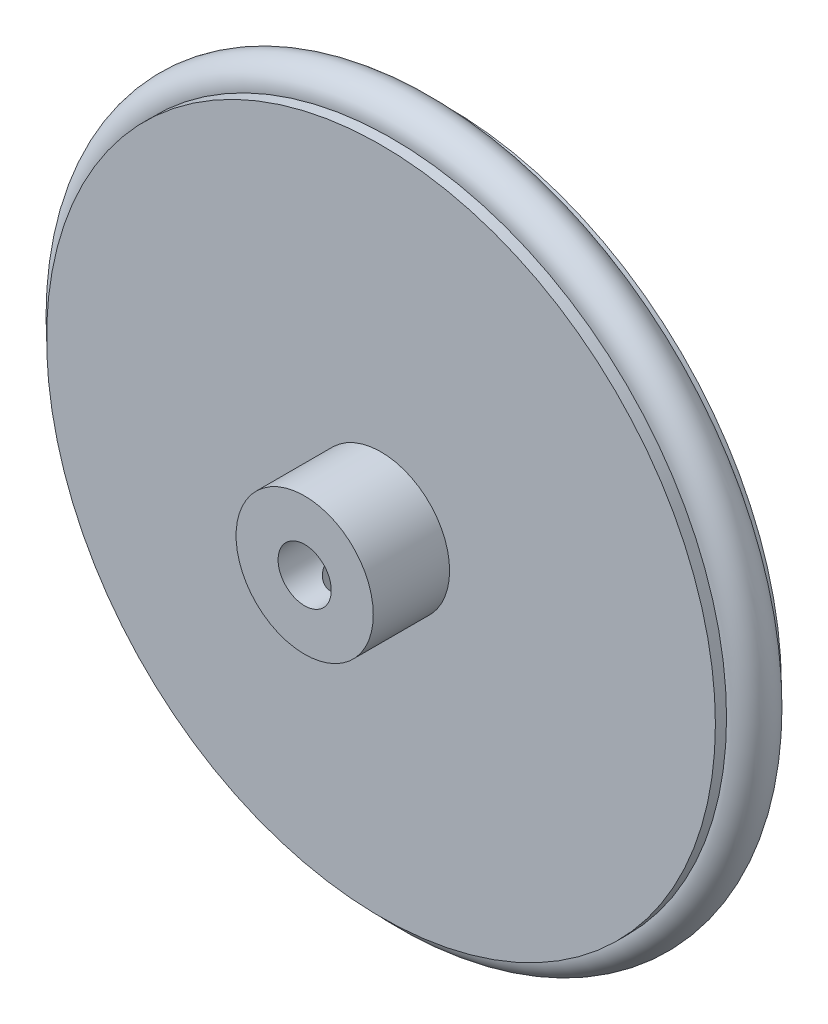
ISO-10303-21;
HEADER;
FILE_DESCRIPTION(('STEP AP214'),'2;1');
FILE_NAME('part.step','',(''),(''),'','','');
FILE_SCHEMA(('AUTOMOTIVE_DESIGN { 1 0 10303 214 1 1 1 1 }'));
ENDSEC;
DATA;
#1=APPLICATION_CONTEXT('core data for automotive mechanical design processes');
#2=APPLICATION_PROTOCOL_DEFINITION('international standard','automotive_design',2000,#1);
#3=PRODUCT_CONTEXT('',#1,'mechanical');
#4=PRODUCT('Part','Part','',(#3));
#5=PRODUCT_RELATED_PRODUCT_CATEGORY('part','',(#4));
#6=PRODUCT_DEFINITION_FORMATION('','',#4);
#7=PRODUCT_DEFINITION_CONTEXT('part definition',#1,'design');
#8=PRODUCT_DEFINITION('design','',#6,#7);
#9=PRODUCT_DEFINITION_SHAPE('','',#8);
#10=(LENGTH_UNIT() NAMED_UNIT(*) SI_UNIT(.MILLI.,.METRE.));
#11=(NAMED_UNIT(*) PLANE_ANGLE_UNIT() SI_UNIT($,.RADIAN.));
#12=(NAMED_UNIT(*) SI_UNIT($,.STERADIAN.) SOLID_ANGLE_UNIT());
#13=UNCERTAINTY_MEASURE_WITH_UNIT(LENGTH_MEASURE(1.E-05),#10,'distance_accuracy_value','');
#14=(GEOMETRIC_REPRESENTATION_CONTEXT(3) GLOBAL_UNCERTAINTY_ASSIGNED_CONTEXT((#13)) GLOBAL_UNIT_ASSIGNED_CONTEXT((#10,
#11,#12)) REPRESENTATION_CONTEXT('',''));
#15=CARTESIAN_POINT('',(0.,0.,0.));
#16=DIRECTION('',(0.,0.,1.));
#17=DIRECTION('',(1.,0.,0.));
#18=AXIS2_PLACEMENT_3D('',#15,#16,#17);
#19=CARTESIAN_POINT('',(0.,0.,0.));
#20=DIRECTION('',(0.,0.,-1.));
#21=DIRECTION('',(-1.,0.,0.));
#22=AXIS2_PLACEMENT_3D('',#19,#20,#21);
#23=TOROIDAL_SURFACE('',#22,39.2945047926736,2.56123692555145);
#24=CARTESIAN_POINT('',(39.2945047926736,0.,0.));
#25=DIRECTION('',(0.,1.,0.));
#26=DIRECTION('',(0.,0.,1.));
#27=AXIS2_PLACEMENT_3D('',#24,#25,#26);
#28=CIRCLE('',#27,2.56123692555145);
#29=CARTESIAN_POINT('',(41.855741718225,0.,0.));
#30=VERTEX_POINT('',#29);
#31=EDGE_CURVE('E11',#30,#30,#28,.T.);
#32=CARTESIAN_POINT('',(0.,0.,0.));
#33=DIRECTION('',(0.,0.,-1.));
#34=DIRECTION('',(-1.,0.,0.));
#35=AXIS2_PLACEMENT_3D('',#32,#33,#34);
#36=CIRCLE('',#35,41.855741718225);
#37=EDGE_CURVE('',#30,#30,#36,.T.);
#38=ORIENTED_EDGE('',*,*,#31,.F.);
#39=ORIENTED_EDGE('',*,*,#31,.T.);
#40=ORIENTED_EDGE('',*,*,#37,.T.);
#41=ORIENTED_EDGE('',*,*,#37,.F.);
#42=EDGE_LOOP('',(#38,#40,#39,#41));
#43=FACE_BOUND('',#42,.T.);
#44=ADVANCED_FACE('F52',(#43),#23,.T.);
#45=CLOSED_SHELL('',(#44));
#46=MANIFOLD_SOLID_BREP('B2',#45);
#47=CARTESIAN_POINT('',(0.,0.,3.85));
#48=DIRECTION('',(0.,0.,-1.));
#49=DIRECTION('',(-1.,0.,0.));
#50=AXIS2_PLACEMENT_3D('',#47,#48,#49);
#51=CYLINDRICAL_SURFACE('',#50,39.);
#52=CARTESIAN_POINT('',(0.,0.,2.55));
#53=DIRECTION('',(0.,0.,-1.));
#54=DIRECTION('',(-1.,0.,0.));
#55=AXIS2_PLACEMENT_3D('',#52,#53,#54);
#56=CIRCLE('',#55,39.);
#57=CARTESIAN_POINT('',(39.,0.,2.55));
#58=VERTEX_POINT('',#57);
#59=EDGE_CURVE('E87',#58,#58,#56,.F.);
#60=ORIENTED_EDGE('',*,*,#59,.T.);
#61=EDGE_LOOP('',(#60));
#62=FACE_BOUND('',#61,.T.);
#63=CARTESIAN_POINT('',(0.,0.,3.85));
#64=DIRECTION('',(0.,0.,1.));
#65=DIRECTION('',(1.,0.,0.));
#66=AXIS2_PLACEMENT_3D('',#63,#64,#65);
#67=CIRCLE('',#66,39.);
#68=CARTESIAN_POINT('',(39.,0.,3.85));
#69=VERTEX_POINT('',#68);
#70=EDGE_CURVE('E107',#69,#69,#67,.T.);
#71=ORIENTED_EDGE('',*,*,#70,.F.);
#72=EDGE_LOOP('',(#71));
#73=FACE_BOUND('',#72,.T.);
#74=ADVANCED_FACE('F72',(#62,#73),#51,.T.);
#75=CARTESIAN_POINT('',(0.,0.,3.85));
#76=DIRECTION('',(0.,0.,1.));
#77=DIRECTION('',(1.,0.,0.));
#78=AXIS2_PLACEMENT_3D('',#75,#76,#77);
#79=PLANE('',#78);
#80=CARTESIAN_POINT('',(0.,0.,3.85));
#81=DIRECTION('',(0.,0.,1.));
#82=DIRECTION('',(1.,0.,0.));
#83=AXIS2_PLACEMENT_3D('',#80,#81,#82);
#84=CIRCLE('',#83,8.);
#85=CARTESIAN_POINT('',(8.,0.,3.85));
#86=VERTEX_POINT('',#85);
#87=EDGE_CURVE('E50',#86,#86,#84,.T.);
#88=ORIENTED_EDGE('',*,*,#87,.F.);
#89=EDGE_LOOP('',(#88));
#90=FACE_BOUND('',#89,.T.);
#91=ORIENTED_EDGE('',*,*,#70,.T.);
#92=EDGE_LOOP('',(#91));
#93=FACE_BOUND('',#92,.T.);
#94=ADVANCED_FACE('F121',(#90,#93),#79,.T.);
#95=CARTESIAN_POINT('',(0.,0.,0.));
#96=DIRECTION('',(0.,0.,1.));
#97=DIRECTION('',(1.,0.,0.));
#98=AXIS2_PLACEMENT_3D('',#95,#96,#97);
#99=TOROIDAL_SURFACE('',#98,39.,2.55);
#100=CARTESIAN_POINT('',(39.,0.,0.));
#101=DIRECTION('',(0.,1.,0.));
#102=DIRECTION('',(0.,0.,1.));
#103=AXIS2_PLACEMENT_3D('',#100,#101,#102);
#104=CIRCLE('',#103,2.55);
#105=CARTESIAN_POINT('',(39.,0.,-2.55));
#106=VERTEX_POINT('',#105);
#107=EDGE_CURVE('E95',#106,#58,#104,.T.);
#108=ORIENTED_EDGE('',*,*,#107,.F.);
#109=CARTESIAN_POINT('',(0.,0.,-2.55));
#110=DIRECTION('',(0.,0.,1.));
#111=DIRECTION('',(1.,0.,0.));
#112=AXIS2_PLACEMENT_3D('',#109,#110,#111);
#113=CIRCLE('',#112,39.);
#114=EDGE_CURVE('E98',#106,#106,#113,.F.);
#115=ORIENTED_EDGE('',*,*,#114,.F.);
#116=ORIENTED_EDGE('',*,*,#107,.T.);
#117=ORIENTED_EDGE('',*,*,#59,.F.);
#118=EDGE_LOOP('',(#108,#115,#116,#117));
#119=FACE_BOUND('',#118,.T.);
#120=ADVANCED_FACE('F96',(#119),#99,.F.);
#121=CARTESIAN_POINT('',(0.,0.,-3.85));
#122=DIRECTION('',(0.,0.,1.));
#123=DIRECTION('',(1.,0.,0.));
#124=AXIS2_PLACEMENT_3D('',#121,#122,#123);
#125=PLANE('',#124);
#126=CARTESIAN_POINT('',(0.,0.,-3.85));
#127=DIRECTION('',(0.,0.,1.));
#128=DIRECTION('',(1.,0.,0.));
#129=AXIS2_PLACEMENT_3D('',#126,#127,#128);
#130=CIRCLE('',#129,39.);
#131=CARTESIAN_POINT('',(39.,0.,-3.85));
#132=VERTEX_POINT('',#131);
#133=EDGE_CURVE('E101',#132,#132,#130,.T.);
#134=ORIENTED_EDGE('',*,*,#133,.F.);
#135=EDGE_LOOP('',(#134));
#136=FACE_BOUND('',#135,.T.);
#137=ADVANCED_FACE('F130',(#136),#125,.F.);
#138=ORIENTED_EDGE('',*,*,#114,.T.);
#139=EDGE_LOOP('',(#138));
#140=FACE_BOUND('',#139,.T.);
#141=ORIENTED_EDGE('',*,*,#133,.T.);
#142=EDGE_LOOP('',(#141));
#143=FACE_BOUND('',#142,.T.);
#144=ADVANCED_FACE('F74',(#140,#143),#51,.T.);
#145=CARTESIAN_POINT('',(0.,0.,12.75));
#146=DIRECTION('',(0.,0.,-1.));
#147=DIRECTION('',(-1.,0.,0.));
#148=AXIS2_PLACEMENT_3D('',#145,#146,#147);
#149=CYLINDRICAL_SURFACE('',#148,8.);
#150=CARTESIAN_POINT('',(0.,-8.00000000000001,9.75));
#151=CARTESIAN_POINT('',(0.123780136226794,-7.99999842187128,9.74999762466524));
#152=CARTESIAN_POINT('',(0.247584907831838,-7.99709927975129,9.73975154955323));
#153=CARTESIAN_POINT('',(0.4916113733975,-7.98581625144001,9.69912092746626));
#154=CARTESIAN_POINT('',(0.611831603090772,-7.97743015509969,9.66872826536708));
#155=CARTESIAN_POINT('',(0.845132540047836,-7.95609599210553,9.58888321400657));
#156=CARTESIAN_POINT('',(0.958222777735977,-7.94315417420684,9.53945692312136));
#157=CARTESIAN_POINT('',(1.17450981060238,-7.91406663243914,9.4230488128937));
#158=CARTESIAN_POINT('',(1.27770565752827,-7.89792060194112,9.35606531320689));
#159=CARTESIAN_POINT('',(1.47391114059968,-7.86369767273313,9.20463867647517));
#160=CARTESIAN_POINT('',(1.5666320582482,-7.84558491763583,9.11982955125715));
#161=CARTESIAN_POINT('',(1.73674045164914,-7.80969310823846,8.93594041092291));
#162=CARTESIAN_POINT('',(1.81412570935584,-7.79191410254578,8.83685833503763));
#163=CARTESIAN_POINT('',(1.95282069316971,-7.75833082506188,8.6248728664803));
#164=CARTESIAN_POINT('',(2.01378972318442,-7.74257151336369,8.5117387845405));
#165=CARTESIAN_POINT('',(2.11572381813796,-7.71534289740211,8.27630984893527));
#166=CARTESIAN_POINT('',(2.15669303705113,-7.70387270240217,8.15401690366346));
#167=CARTESIAN_POINT('',(2.21644550121994,-7.68689269299952,7.90695889737664));
#168=CARTESIAN_POINT('',(2.23575604849789,-7.6812415038316,7.78233133077991));
#169=CARTESIAN_POINT('',(2.25328816095871,-7.67611771194809,7.53148722896237));
#170=CARTESIAN_POINT('',(2.25151415202463,-7.67664381255033,7.40527103276911));
#171=CARTESIAN_POINT('',(2.22734423131721,-7.6836891439777,7.15901963772495));
#172=CARTESIAN_POINT('',(2.20559571333701,-7.69002021911333,7.0389146421979));
#173=CARTESIAN_POINT('',(2.14313486827327,-7.70765955284748,6.80413145670784));
#174=CARTESIAN_POINT('',(2.10242087445025,-7.71896824888853,6.68945374468577));
#175=CARTESIAN_POINT('',(2.00267907192456,-7.7454475005861,6.46713725641916));
#176=CARTESIAN_POINT('',(1.94343157951608,-7.7606639669854,6.35960274110322));
#177=CARTESIAN_POINT('',(1.8084575746412,-7.7932206851871,6.15577902306305));
#178=CARTESIAN_POINT('',(1.73272749416113,-7.81056139647251,6.05949226210517));
#179=CARTESIAN_POINT('',(1.56366800478981,-7.84618747121736,5.87720947019052));
#180=CARTESIAN_POINT('',(1.46979757357976,-7.86448422457825,5.79171666666484));
#181=CARTESIAN_POINT('',(1.26882591772857,-7.89939668632421,5.63757732851264));
#182=CARTESIAN_POINT('',(1.16172404941149,-7.91601231285513,5.56893161393992));
#183=CARTESIAN_POINT('',(0.936493342648719,-7.94581242298405,5.45017851457242));
#184=CARTESIAN_POINT('',(0.818309290352517,-7.95897833521144,5.40017088166099));
#185=CARTESIAN_POINT('',(0.574754739241742,-7.98026169134054,5.32088384945746));
#186=CARTESIAN_POINT('',(0.449386001714237,-7.9883803668122,5.29159939328749));
#187=CARTESIAN_POINT('',(0.199308367677802,-7.998464596019,5.25540024709012));
#188=CARTESIAN_POINT('',(0.0747057939807261,-8.0006180153968,5.2478023339393));
#189=CARTESIAN_POINT('',(-0.173996342344962,-7.99907390001736,5.2532932007652));
#190=CARTESIAN_POINT('',(-0.298095961627185,-7.9953770437071,5.26637958201765));
#191=CARTESIAN_POINT('',(-0.539771482113883,-7.98266987007641,5.3123102350041));
#192=CARTESIAN_POINT('',(-0.657427283699722,-7.97376417367825,5.34476572723926));
#193=CARTESIAN_POINT('',(-0.885607078707533,-7.95165716960974,5.42805495818694));
#194=CARTESIAN_POINT('',(-0.996130256988526,-7.93845537200409,5.47889079310108));
#195=CARTESIAN_POINT('',(-1.20950279554106,-7.90879007934736,5.59871332329094));
#196=CARTESIAN_POINT('',(-1.31214014467195,-7.89226344568531,5.66806151949523));
#197=CARTESIAN_POINT('',(-1.50455798960204,-7.85785438337425,5.8224924240432));
#198=CARTESIAN_POINT('',(-1.59433564471718,-7.83997165649679,5.90757859939725));
#199=CARTESIAN_POINT('',(-1.76142096314826,-7.80416160393672,6.09426987947858));
#200=CARTESIAN_POINT('',(-1.8382445470943,-7.78625074860463,6.19631225154643));
#201=CARTESIAN_POINT('',(-1.97369813128561,-7.75302507175317,6.41222522167506));
#202=CARTESIAN_POINT('',(-2.03232880180364,-7.73771015460234,6.52609538376391));
#203=CARTESIAN_POINT('',(-2.12929950951797,-7.71158917229136,6.76193196728152));
#204=CARTESIAN_POINT('',(-2.16775011069942,-7.70075860843757,6.88385006280372));
#205=CARTESIAN_POINT('',(-2.22349012424077,-7.68485185034712,7.13278367532591));
#206=CARTESIAN_POINT('',(-2.24078570184269,-7.67977397962584,7.25979769606233));
#207=CARTESIAN_POINT('',(-2.25334169418252,-7.67609849118048,7.51033188151335));
#208=CARTESIAN_POINT('',(-2.24938460541638,-7.67727074007363,7.63381000794404));
#209=CARTESIAN_POINT('',(-2.2213850908605,-7.6854184230624,7.87826256786734));
#210=CARTESIAN_POINT('',(-2.19734329687038,-7.69239367461435,7.99923707999286));
#211=CARTESIAN_POINT('',(-2.13033324239048,-7.71121681688845,8.23413919589634));
#212=CARTESIAN_POINT('',(-2.08754834058224,-7.72301742974187,8.34812316659981));
#213=CARTESIAN_POINT('',(-1.98440836173859,-7.75015834714451,8.56738423787042));
#214=CARTESIAN_POINT('',(-1.92405025656109,-7.76549926164939,8.67265983382815));
#215=CARTESIAN_POINT('',(-1.78517994907601,-7.79861380514403,8.87520723961234));
#216=CARTESIAN_POINT('',(-1.70614225848473,-7.81645021615238,8.97210852835556));
#217=CARTESIAN_POINT('',(-1.53313294180605,-7.85221584609079,9.1515265621647));
#218=CARTESIAN_POINT('',(-1.43915759379494,-7.87014508707076,9.23403971145356));
#219=CARTESIAN_POINT('',(-1.23615231046758,-7.90460443408529,9.38434752656683));
#220=CARTESIAN_POINT('',(-1.12680885741895,-7.92108926149717,9.45173010301457));
#221=CARTESIAN_POINT('',(-0.897882751335927,-7.95028824463795,9.56705378137655));
#222=CARTESIAN_POINT('',(-0.778305978948956,-7.96300454747144,9.61500595943953));
#223=CARTESIAN_POINT('',(-0.549510786908445,-7.98181255353578,9.68467079174465));
#224=CARTESIAN_POINT('',(-0.441170382357759,-7.98858039163813,9.70910846479046));
#225=CARTESIAN_POINT('',(-0.221893033303146,-7.99767454528477,9.74177312290159));
#226=CARTESIAN_POINT('',(-0.110956414302969,-8.00000141463333,9.75000212924816));
#227=CARTESIAN_POINT('',(0.,-8.00000000000001,9.75));
#228=B_SPLINE_CURVE_WITH_KNOTS('',3,(#150,#151,#152,#153,#154,#155,#156,#157,#158,#159,#160,
#161,#162,#163,#164,#165,#166,#167,#168,#169,#170,#171,#172,#173,#174,#175,#176,#177,#178,#179,
#180,#181,#182,#183,#184,#185,#186,#187,#188,#189,#190,#191,#192,#193,#194,#195,#196,#197,#198,
#199,#200,#201,#202,#203,#204,#205,#206,#207,#208,#209,#210,#211,#212,#213,#214,#215,#216,#217,
#218,#219,#220,#221,#222,#223,#224,#225,#226,#227),.UNSPECIFIED.,.T.,.F.,(4,2,2,2,2,2,2,2,2,2,2,
2,2,2,2,2,2,2,2,2,2,2,2,2,2,2,2,2,2,2,2,2,2,2,2,2,2,2,4),(0.,0.370933225325725,0.74201595487525,
1.11259166760489,1.48320285991021,1.86233426372981,2.2415204625844,2.62805703120606,
3.01451328172577,3.39134154209223,3.76809070340941,4.13304415875026,4.49802969328196,
4.86751685045546,5.23708407082971,5.62012636061606,6.00318729178399,6.38826990510992,
6.77325851798922,7.14597673997026,7.51865174159086,7.88408671145808,8.24956337081547,
8.62277786221353,8.99607466932328,9.38117545756858,9.766262056046,10.1492161894789,
10.5320586913703,10.900904309342,11.2697383250648,11.6350420183846,12.0004086966269,
12.377630113844,12.7549456687473,13.1415448143547,13.5279232710186,13.8604689874155,
14.1929732314936),.UNSPECIFIED.);
#229=CARTESIAN_POINT('',(0.,-8.00000000000001,9.75));
#230=VERTEX_POINT('',#229);
#231=EDGE_CURVE('E158',#230,#230,#228,.T.);
#232=ORIENTED_EDGE('',*,*,#231,.T.);
#233=EDGE_LOOP('',(#232));
#234=FACE_BOUND('',#233,.T.);
#235=CARTESIAN_POINT('',(0.,0.,12.75));
#236=DIRECTION('',(0.,0.,1.));
#237=DIRECTION('',(1.,0.,0.));
#238=AXIS2_PLACEMENT_3D('',#235,#236,#237);
#239=CIRCLE('',#238,8.);
#240=CARTESIAN_POINT('',(8.,0.,12.75));
#241=VERTEX_POINT('',#240);
#242=EDGE_CURVE('E102',#241,#241,#239,.T.);
#243=ORIENTED_EDGE('',*,*,#242,.F.);
#244=EDGE_LOOP('',(#243));
#245=FACE_BOUND('',#244,.T.);
#246=ORIENTED_EDGE('',*,*,#87,.T.);
#247=EDGE_LOOP('',(#246));
#248=FACE_BOUND('',#247,.T.);
#249=ADVANCED_FACE('F139',(#234,#245,#248),#149,.T.);
#250=CARTESIAN_POINT('',(0.,0.,12.75));
#251=DIRECTION('',(0.,0.,1.));
#252=DIRECTION('',(1.,0.,0.));
#253=AXIS2_PLACEMENT_3D('',#250,#251,#252);
#254=PLANE('',#253);
#255=CARTESIAN_POINT('',(0.,0.,12.75));
#256=DIRECTION('',(0.,0.,1.));
#257=DIRECTION('',(1.,0.,0.));
#258=AXIS2_PLACEMENT_3D('',#255,#256,#257);
#259=CIRCLE('',#258,3.1);
#260=CARTESIAN_POINT('',(3.1,0.,12.75));
#261=VERTEX_POINT('',#260);
#262=EDGE_CURVE('E164',#261,#261,#259,.T.);
#263=ORIENTED_EDGE('',*,*,#262,.F.);
#264=EDGE_LOOP('',(#263));
#265=FACE_BOUND('',#264,.T.);
#266=ORIENTED_EDGE('',*,*,#242,.T.);
#267=EDGE_LOOP('',(#266));
#268=FACE_BOUND('',#267,.T.);
#269=ADVANCED_FACE('F146',(#265,#268),#254,.T.);
#270=CARTESIAN_POINT('',(0.,0.,-12.6181240867132));
#271=DIRECTION('',(0.,0.,1.));
#272=DIRECTION('',(1.,0.,0.));
#273=AXIS2_PLACEMENT_3D('',#270,#271,#272);
#274=CYLINDRICAL_SURFACE('',#273,3.1);
#275=CARTESIAN_POINT('',(0.,-3.10000000000001,9.75));
#276=CARTESIAN_POINT('',(-0.110697416157224,-3.09999413042264,9.74999382963892));
#277=CARTESIAN_POINT('',(-0.221590520111746,-3.09400684955362,9.74176450951274));
#278=CARTESIAN_POINT('',(-0.439927098532394,-3.07060139094694,9.70934711929065));
#279=CARTESIAN_POINT('',(-0.547360500065594,-3.05315253278806,9.68511621512181));
#280=CARTESIAN_POINT('',(-0.755026772421032,-3.0085128950155,9.62229458361214));
#281=CARTESIAN_POINT('',(-0.855298486308808,-2.9813803673454,9.58378966888485));
#282=CARTESIAN_POINT('',(-1.04734888854479,-2.9194613486196,9.49419181177459));
#283=CARTESIAN_POINT('',(-1.1391305301893,-2.8846775334169,9.44310326946521));
#284=CARTESIAN_POINT('',(-1.32110454071244,-2.8063080534359,9.32483162878368));
#285=CARTESIAN_POINT('',(-1.41039541643049,-2.7622098953641,9.25660817196956));
#286=CARTESIAN_POINT('',(-1.57705756074761,-2.6705725194023,9.10867409945118));
#287=CARTESIAN_POINT('',(-1.6544095082245,-2.62302790298541,9.02894525940309));
#288=CARTESIAN_POINT('',(-1.81011647270747,-2.5186951516302,8.84290311951938));
#289=CARTESIAN_POINT('',(-1.88586488022928,-2.46186859734943,8.73441761144955));
#290=CARTESIAN_POINT('',(-2.01821857147733,-2.35457536736805,8.50346811924064));
#291=CARTESIAN_POINT('',(-2.07485334061316,-2.30409897183571,8.38102605900943));
#292=CARTESIAN_POINT('',(-2.15125246736728,-2.23246678542695,8.16560365309112));
#293=CARTESIAN_POINT('',(-2.17701714690328,-2.20712645452975,8.07616154253332));
#294=CARTESIAN_POINT('',(-2.21745137814552,-2.16650434061417,7.89267617220353));
#295=CARTESIAN_POINT('',(-2.23214533458044,-2.15120044260994,7.79864352251732));
#296=CARTESIAN_POINT('',(-2.24948721253017,-2.13306962467198,7.60752135219142));
#297=CARTESIAN_POINT('',(-2.25204789189956,-2.13033307228802,7.51041473164771));
#298=CARTESIAN_POINT('',(-2.24464867523125,-2.13812331947887,7.31719035259499));
#299=CARTESIAN_POINT('',(-2.2346794181905,-2.1486600354067,7.22107338755933));
#300=CARTESIAN_POINT('',(-2.20119403517962,-2.18297120975222,7.0218569368788));
#301=CARTESIAN_POINT('',(-2.17623102004368,-2.20814868562707,6.91925399594988));
#302=CARTESIAN_POINT('',(-2.11343865419874,-2.26831577010523,6.72106431449029));
#303=CARTESIAN_POINT('',(-2.0755797052216,-2.30332791817065,6.62549433489627));
#304=CARTESIAN_POINT('',(-1.97386684190556,-2.39159912644828,6.41156456967879));
#305=CARTESIAN_POINT('',(-1.90555427247762,-2.44704876776043,6.29623897592775));
#306=CARTESIAN_POINT('',(-1.75043145449706,-2.56032264218934,6.08006737044625));
#307=CARTESIAN_POINT('',(-1.66360128873676,-2.61814937757181,5.97923714674686));
#308=CARTESIAN_POINT('',(-1.47118529181215,-2.73097346911746,5.79227784525893));
#309=CARTESIAN_POINT('',(-1.36538341949777,-2.78592766274732,5.70634327946627));
#310=CARTESIAN_POINT('',(-1.1370230310073,-2.8866345716843,5.55360827776082));
#311=CARTESIAN_POINT('',(-1.01450393677332,-2.93240832673643,5.48676393811977));
#312=CARTESIAN_POINT('',(-0.788627677578771,-2.99969920508554,5.39012882158911));
#313=CARTESIAN_POINT('',(-0.688405051494467,-3.02442639373746,5.35523236053581));
#314=CARTESIAN_POINT('',(-0.482215513709955,-3.0640584374519,5.2996960023966));
#315=CARTESIAN_POINT('',(-0.376252891385496,-3.0789705204675,5.27904561380384));
#316=CARTESIAN_POINT('',(-0.161078609497874,-3.09770131587362,5.25315011786828));
#317=CARTESIAN_POINT('',(-0.051856671720934,-3.1014801016493,5.24796045557547));
#318=CARTESIAN_POINT('',(0.165973278443137,-3.09746959971357,5.25348673268703));
#319=CARTESIAN_POINT('',(0.274581259263748,-3.08967972253438,5.26420348258415));
#320=CARTESIAN_POINT('',(0.481871229640903,-3.06400312880973,5.29982835104608));
#321=CARTESIAN_POINT('',(0.580770021892697,-3.04669844055079,5.32391912331878));
#322=CARTESIAN_POINT('',(0.772760573844533,-3.00375236337328,5.38446638673616));
#323=CARTESIAN_POINT('',(0.8658511258868,-2.97810924755591,5.42092543943494));
#324=CARTESIAN_POINT('',(1.0522467380221,-2.91773369451282,5.50832879996848));
#325=CARTESIAN_POINT('',(1.14490695829672,-2.88241683691821,5.56023585926243));
#326=CARTESIAN_POINT('',(1.32051927499855,-2.80631531621985,5.67523581578141));
#327=CARTESIAN_POINT('',(1.40346470633029,-2.76552693991724,5.73833631879877));
#328=CARTESIAN_POINT('',(1.57326743128734,-2.67316077350883,5.88684137514481));
#329=CARTESIAN_POINT('',(1.65807116708502,-2.62097318148977,5.97421463999991));
#330=CARTESIAN_POINT('',(1.81263896007123,-2.51655260486344,6.16149291062313));
#331=CARTESIAN_POINT('',(1.8823913503233,-2.46431961632943,6.26140754353135));
#332=CARTESIAN_POINT('',(1.99805292955318,-2.37119993785875,6.45991179867526));
#333=CARTESIAN_POINT('',(2.04585069583863,-2.32971058852474,6.55711301924056));
#334=CARTESIAN_POINT('',(2.12768651695197,-2.25521984701163,6.76015487672688));
#335=CARTESIAN_POINT('',(2.16175339913675,-2.22220072556384,6.86597684694658));
#336=CARTESIAN_POINT('',(2.20864844111265,-2.17548528767736,7.06156791494186));
#337=CARTESIAN_POINT('',(2.22444827119152,-2.15917642020769,7.14998346720562));
#338=CARTESIAN_POINT('',(2.24532830701458,-2.13746148651269,7.32934637938949));
#339=CARTESIAN_POINT('',(2.25042346613899,-2.13204021185089,7.42029002750492));
#340=CARTESIAN_POINT('',(2.24952044820626,-2.13299258586604,7.60217736448242));
#341=CARTESIAN_POINT('',(2.24350759489638,-2.13938183898769,7.69312089441522));
#342=CARTESIAN_POINT('',(2.22082938426629,-2.16290770165235,7.87229525193139));
#343=CARTESIAN_POINT('',(2.20414722960452,-2.18006125730021,7.96052157166226));
#344=CARTESIAN_POINT('',(2.15446197378919,-2.22931565996096,8.15897765752168));
#345=CARTESIAN_POINT('',(2.11800912214611,-2.26439695243265,8.26758575854015));
#346=CARTESIAN_POINT('',(2.03068472773898,-2.34302524613226,8.4754975772678));
#347=CARTESIAN_POINT('',(1.97978891009468,-2.38658646087181,8.5747852526574));
#348=CARTESIAN_POINT('',(1.86326367417984,-2.47869372980022,8.76635896713314));
#349=CARTESIAN_POINT('',(1.79724843787302,-2.52734798997782,8.85835699691762));
#350=CARTESIAN_POINT('',(1.65218425183031,-2.62448800724665,9.03152433885641));
#351=CARTESIAN_POINT('',(1.57313005160012,-2.67297368839115,9.11268926484807));
#352=CARTESIAN_POINT('',(1.38420346174315,-2.77629996512688,9.27917479138685));
#353=CARTESIAN_POINT('',(1.27135076728273,-2.83030793031885,9.36172695951179));
#354=CARTESIAN_POINT('',(1.08960392794629,-2.90293719917625,9.46983235101875));
#355=CARTESIAN_POINT('',(1.02693818920856,-2.92575132676768,9.50324904174968));
#356=CARTESIAN_POINT('',(0.897787020607609,-2.96792603751069,9.56435871598997));
#357=CARTESIAN_POINT('',(0.831303606819271,-2.98728842171635,9.5920546856668));
#358=CARTESIAN_POINT('',(0.665653499803269,-3.02935719781305,9.65177422698069));
#359=CARTESIAN_POINT('',(0.56472856499571,-3.0499198949932,9.6805354664149));
#360=CARTESIAN_POINT('',(0.358565834709696,-3.080946907161,9.72372698322848));
#361=CARTESIAN_POINT('',(0.253342222170003,-3.09144201268816,9.73820096047701));
#362=CARTESIAN_POINT('',(0.122984296175514,-3.09765793458302,9.74677197771086));
#363=CARTESIAN_POINT('',(0.098415243366404,-3.09853496754704,9.7479811688465));
#364=CARTESIAN_POINT('',(0.0492340244916298,-3.09970669391167,9.74959592263486));
#365=CARTESIAN_POINT('',(0.0246218528574957,-3.10000130553969,9.75000137244145));
#366=CARTESIAN_POINT('',(0.,-3.10000000000001,9.75));
#367=B_SPLINE_CURVE_WITH_KNOTS('',3,(#275,#276,#277,#278,#279,#280,#281,#282,#283,#284,#285,
#286,#287,#288,#289,#290,#291,#292,#293,#294,#295,#296,#297,#298,#299,#300,#301,#302,#303,#304,
#305,#306,#307,#308,#309,#310,#311,#312,#313,#314,#315,#316,#317,#318,#319,#320,#321,#322,#323,
#324,#325,#326,#327,#328,#329,#330,#331,#332,#333,#334,#335,#336,#337,#338,#339,#340,#341,#342,
#343,#344,#345,#346,#347,#348,#349,#350,#351,#352,#353,#354,#355,#356,#357,#358,#359,#360,#361,
#362,#363,#364,#365,#366),.UNSPECIFIED.,.T.,.F.,(4,2,2,2,2,2,2,2,2,2,2,2,2,2,2,2,2,2,2,2,2,2,2,
2,2,2,2,2,2,2,2,2,2,2,2,2,2,2,2,2,2,2,2,2,2,4),(0.,0.331984237921384,0.66486077464122,
0.995767744658375,1.32655917143053,1.68739516648141,2.0488091248681,2.47895265098283,
2.90842955579118,3.19679457504144,3.48452203624509,3.77431524226108,4.06432507892863,
4.38822403857262,4.71287146488088,5.1458290965058,5.57925477996172,6.01797205618268,
6.45567209183163,6.78121468577377,7.10651727750406,7.43298506909091,7.75946949603569,
8.06790377564439,8.37640197310591,8.71093397046384,9.04569415458247,9.44160989372616,
9.83783143021757,10.1846449981373,10.5307266061182,10.8034306047986,11.0757534086399,
11.3484362712246,11.6215494956489,11.9790277645864,12.3371104570027,12.7056185074999,
13.0742753117214,13.5211063500954,13.7445574981821,13.9678917102601,14.2872850240598,
14.6056983670485,14.6795295361551,14.7533710705004),.UNSPECIFIED.);
#368=CARTESIAN_POINT('',(0.,-3.10000000000001,9.75));
#369=VERTEX_POINT('',#368);
#370=EDGE_CURVE('E76',#369,#369,#367,.T.);
#371=ORIENTED_EDGE('',*,*,#370,.T.);
#372=EDGE_LOOP('',(#371));
#373=FACE_BOUND('',#372,.T.);
#374=CARTESIAN_POINT('',(0.,0.,-2.85));
#375=DIRECTION('',(0.,0.,1.));
#376=DIRECTION('',(1.,0.,0.));
#377=AXIS2_PLACEMENT_3D('',#374,#375,#376);
#378=CIRCLE('',#377,3.1);
#379=CARTESIAN_POINT('',(3.1,0.,-2.85));
#380=VERTEX_POINT('',#379);
#381=EDGE_CURVE('E110',#380,#380,#378,.F.);
#382=ORIENTED_EDGE('',*,*,#381,.T.);
#383=EDGE_LOOP('',(#382));
#384=FACE_BOUND('',#383,.T.);
#385=ORIENTED_EDGE('',*,*,#262,.T.);
#386=EDGE_LOOP('',(#385));
#387=FACE_BOUND('',#386,.T.);
#388=ADVANCED_FACE('F151',(#373,#384,#387),#274,.F.);
#389=CARTESIAN_POINT('',(0.,0.,-2.85));
#390=DIRECTION('',(0.,0.,1.));
#391=DIRECTION('',(1.,0.,0.));
#392=AXIS2_PLACEMENT_3D('',#389,#390,#391);
#393=PLANE('',#392);
#394=ORIENTED_EDGE('',*,*,#381,.F.);
#395=EDGE_LOOP('',(#394));
#396=FACE_BOUND('',#395,.T.);
#397=ADVANCED_FACE('F170',(#396),#393,.T.);
#398=CARTESIAN_POINT('',(0.,-41.855741718225,7.5));
#399=DIRECTION('',(0.,1.,0.));
#400=DIRECTION('',(0.,0.,1.));
#401=AXIS2_PLACEMENT_3D('',#398,#399,#400);
#402=CYLINDRICAL_SURFACE('',#401,2.25);
#403=ORIENTED_EDGE('',*,*,#370,.F.);
#404=EDGE_LOOP('',(#403));
#405=FACE_BOUND('',#404,.T.);
#406=ORIENTED_EDGE('',*,*,#231,.F.);
#407=EDGE_LOOP('',(#406));
#408=FACE_BOUND('',#407,.T.);
#409=ADVANCED_FACE('F166',(#405,#408),#402,.F.);
#410=CLOSED_SHELL('',(#74,#94,#120,#137,#144,#249,#269,#388,#397,#409));
#411=MANIFOLD_SOLID_BREP('B6',#410);
#412=ADVANCED_BREP_SHAPE_REPRESENTATION('',(#18,#46,#411),#14);
#413=SHAPE_DEFINITION_REPRESENTATION(#9,#412);
ENDSEC;
END-ISO-10303-21;
